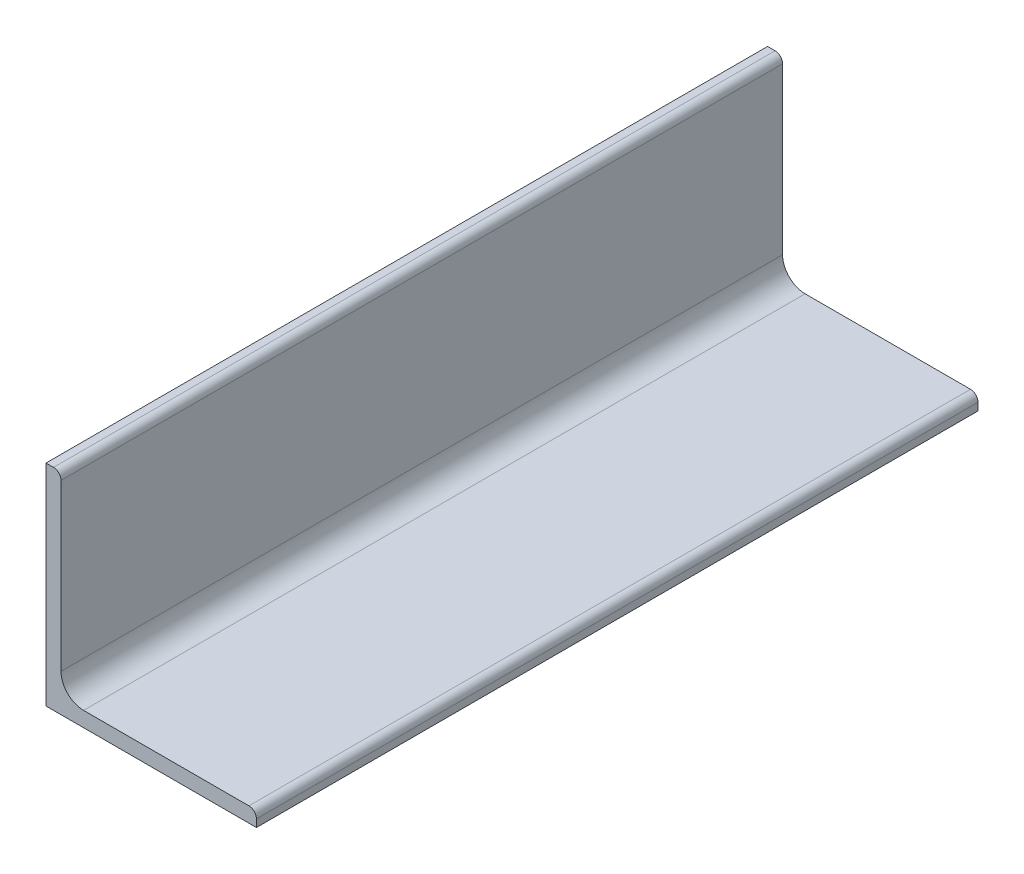
ISO-10303-21;
HEADER;
FILE_DESCRIPTION(('STEP AP214'),'2;1');
FILE_NAME('part.step','',(''),(''),'','','');
FILE_SCHEMA(('AUTOMOTIVE_DESIGN { 1 0 10303 214 1 1 1 1 }'));
ENDSEC;
DATA;
#1=APPLICATION_CONTEXT('core data for automotive mechanical design processes');
#2=APPLICATION_PROTOCOL_DEFINITION('international standard','automotive_design',2000,#1);
#3=PRODUCT_CONTEXT('',#1,'mechanical');
#4=PRODUCT('Part','Part','',(#3));
#5=PRODUCT_RELATED_PRODUCT_CATEGORY('part','',(#4));
#6=PRODUCT_DEFINITION_FORMATION('','',#4);
#7=PRODUCT_DEFINITION_CONTEXT('part definition',#1,'design');
#8=PRODUCT_DEFINITION('design','',#6,#7);
#9=PRODUCT_DEFINITION_SHAPE('','',#8);
#10=(LENGTH_UNIT() NAMED_UNIT(*) SI_UNIT(.MILLI.,.METRE.));
#11=(NAMED_UNIT(*) PLANE_ANGLE_UNIT() SI_UNIT($,.RADIAN.));
#12=(NAMED_UNIT(*) SI_UNIT($,.STERADIAN.) SOLID_ANGLE_UNIT());
#13=UNCERTAINTY_MEASURE_WITH_UNIT(LENGTH_MEASURE(1.E-05),#10,'distance_accuracy_value','');
#14=(GEOMETRIC_REPRESENTATION_CONTEXT(3) GLOBAL_UNCERTAINTY_ASSIGNED_CONTEXT((#13)) GLOBAL_UNIT_ASSIGNED_CONTEXT((#10,
#11,#12)) REPRESENTATION_CONTEXT('',''));
#15=CARTESIAN_POINT('',(0.,0.,0.));
#16=DIRECTION('',(0.,0.,1.));
#17=DIRECTION('',(1.,0.,0.));
#18=AXIS2_PLACEMENT_3D('',#15,#16,#17);
#19=CARTESIAN_POINT('',(0.0836264027816469,89.7372005393545,304.8));
#20=DIRECTION('',(1.,0.,0.));
#21=DIRECTION('',(0.,0.,-1.));
#22=AXIS2_PLACEMENT_3D('',#19,#20,#21);
#23=PLANE('',#22);
#24=DIRECTION('',(0.,-1.,0.));
#25=VECTOR('',#24,1.);
#26=CARTESIAN_POINT('',(0.0836264027816469,89.7372005393545,0.));
#27=LINE('',#26,#25);
#28=CARTESIAN_POINT('',(0.0836264027816469,89.7372005393545,0.));
#29=VERTEX_POINT('',#28);
#30=CARTESIAN_POINT('',(0.0836264027816469,0.837200539354535,0.));
#31=VERTEX_POINT('',#30);
#32=EDGE_CURVE('E135',#29,#31,#27,.T.);
#33=ORIENTED_EDGE('',*,*,#32,.T.);
#34=DIRECTION('',(0.,0.,-1.));
#35=VECTOR('',#34,1.);
#36=CARTESIAN_POINT('',(0.0836264027816469,0.837200539354535,304.8));
#37=LINE('',#36,#35);
#38=CARTESIAN_POINT('',(0.0836264027816469,0.837200539354535,304.8));
#39=VERTEX_POINT('',#38);
#40=EDGE_CURVE('E11',#39,#31,#37,.T.);
#41=ORIENTED_EDGE('',*,*,#40,.F.);
#42=DIRECTION('',(0.,-1.,0.));
#43=VECTOR('',#42,1.);
#44=CARTESIAN_POINT('',(0.0836264027816469,89.7372005393545,304.8));
#45=LINE('',#44,#43);
#46=CARTESIAN_POINT('',(0.0836264027816469,89.7372005393545,304.8));
#47=VERTEX_POINT('',#46);
#48=EDGE_CURVE('E151',#47,#39,#45,.T.);
#49=ORIENTED_EDGE('',*,*,#48,.F.);
#50=DIRECTION('',(0.,0.,-1.));
#51=VECTOR('',#50,1.);
#52=CARTESIAN_POINT('',(0.0836264027816469,89.7372005393545,304.8));
#53=LINE('',#52,#51);
#54=EDGE_CURVE('E131',#47,#29,#53,.T.);
#55=ORIENTED_EDGE('',*,*,#54,.T.);
#56=EDGE_LOOP('',(#33,#41,#49,#55));
#57=FACE_BOUND('',#56,.T.);
#58=ADVANCED_FACE('F33',(#57),#23,.F.);
#59=CARTESIAN_POINT('',(0.0836264027816469,0.837200539354535,304.8));
#60=DIRECTION('',(0.,1.,0.));
#61=DIRECTION('',(0.,0.,1.));
#62=AXIS2_PLACEMENT_3D('',#59,#60,#61);
#63=PLANE('',#62);
#64=DIRECTION('',(1.,0.,0.));
#65=VECTOR('',#64,1.);
#66=CARTESIAN_POINT('',(0.0836264027816469,0.837200539354535,0.));
#67=LINE('',#66,#65);
#68=CARTESIAN_POINT('',(88.9836264027817,0.837200539354535,0.));
#69=VERTEX_POINT('',#68);
#70=EDGE_CURVE('E138',#31,#69,#67,.T.);
#71=ORIENTED_EDGE('',*,*,#70,.T.);
#72=DIRECTION('',(0.,0.,-1.));
#73=VECTOR('',#72,1.);
#74=CARTESIAN_POINT('',(88.9836264027817,0.837200539354535,304.8));
#75=LINE('',#74,#73);
#76=CARTESIAN_POINT('',(88.9836264027817,0.837200539354535,304.8));
#77=VERTEX_POINT('',#76);
#78=EDGE_CURVE('E41',#77,#69,#75,.T.);
#79=ORIENTED_EDGE('',*,*,#78,.F.);
#80=DIRECTION('',(1.,0.,0.));
#81=VECTOR('',#80,1.);
#82=CARTESIAN_POINT('',(0.0836264027816469,0.837200539354535,304.8));
#83=LINE('',#82,#81);
#84=EDGE_CURVE('E95',#39,#77,#83,.T.);
#85=ORIENTED_EDGE('',*,*,#84,.F.);
#86=ORIENTED_EDGE('',*,*,#40,.T.);
#87=EDGE_LOOP('',(#71,#79,#85,#86));
#88=FACE_BOUND('',#87,.T.);
#89=ADVANCED_FACE('F194',(#88),#63,.F.);
#90=CARTESIAN_POINT('',(88.9836264027817,0.837200539354535,304.8));
#91=DIRECTION('',(-1.,0.,0.));
#92=DIRECTION('',(0.,0.,1.));
#93=AXIS2_PLACEMENT_3D('',#90,#91,#92);
#94=PLANE('',#93);
#95=DIRECTION('',(0.,1.,0.));
#96=VECTOR('',#95,1.);
#97=CARTESIAN_POINT('',(88.9836264027817,0.837200539354535,0.));
#98=LINE('',#97,#96);
#99=CARTESIAN_POINT('',(88.9836264027817,4.01220053935453,0.));
#100=VERTEX_POINT('',#99);
#101=EDGE_CURVE('E140',#69,#100,#98,.T.);
#102=ORIENTED_EDGE('',*,*,#101,.T.);
#103=DIRECTION('',(0.,0.,-1.));
#104=VECTOR('',#103,1.);
#105=CARTESIAN_POINT('',(88.9836264027817,4.01220053935453,304.8));
#106=LINE('',#105,#104);
#107=CARTESIAN_POINT('',(88.9836264027817,4.01220053935453,304.8));
#108=VERTEX_POINT('',#107);
#109=EDGE_CURVE('E161',#108,#100,#106,.T.);
#110=ORIENTED_EDGE('',*,*,#109,.F.);
#111=DIRECTION('',(0.,1.,0.));
#112=VECTOR('',#111,1.);
#113=CARTESIAN_POINT('',(88.9836264027817,0.837200539354535,304.8));
#114=LINE('',#113,#112);
#115=EDGE_CURVE('E169',#77,#108,#114,.T.);
#116=ORIENTED_EDGE('',*,*,#115,.F.);
#117=ORIENTED_EDGE('',*,*,#78,.T.);
#118=EDGE_LOOP('',(#102,#110,#116,#117));
#119=FACE_BOUND('',#118,.T.);
#120=ADVANCED_FACE('F167',(#119),#94,.F.);
#121=CARTESIAN_POINT('',(85.8086264027816,4.01220053935453,304.8));
#122=DIRECTION('',(0.,0.,-1.));
#123=DIRECTION('',(-1.,0.,0.));
#124=AXIS2_PLACEMENT_3D('',#121,#122,#123);
#125=CYLINDRICAL_SURFACE('',#124,3.17500000000001);
#126=CARTESIAN_POINT('',(85.8086264027816,4.01220053935453,0.));
#127=DIRECTION('',(0.,0.,1.));
#128=DIRECTION('',(1.,0.,0.));
#129=AXIS2_PLACEMENT_3D('',#126,#127,#128);
#130=CIRCLE('',#129,3.17500000000001);
#131=CARTESIAN_POINT('',(85.8086264027816,7.18720053935454,0.));
#132=VERTEX_POINT('',#131);
#133=EDGE_CURVE('E142',#100,#132,#130,.T.);
#134=ORIENTED_EDGE('',*,*,#133,.T.);
#135=DIRECTION('',(0.,0.,-1.));
#136=VECTOR('',#135,1.);
#137=CARTESIAN_POINT('',(85.8086264027816,7.18720053935454,304.8));
#138=LINE('',#137,#136);
#139=CARTESIAN_POINT('',(85.8086264027816,7.18720053935454,304.8));
#140=VERTEX_POINT('',#139);
#141=EDGE_CURVE('E158',#140,#132,#138,.T.);
#142=ORIENTED_EDGE('',*,*,#141,.F.);
#143=CARTESIAN_POINT('',(85.8086264027816,4.01220053935453,304.8));
#144=DIRECTION('',(0.,0.,1.));
#145=DIRECTION('',(1.,0.,0.));
#146=AXIS2_PLACEMENT_3D('',#143,#144,#145);
#147=CIRCLE('',#146,3.17500000000001);
#148=EDGE_CURVE('E185',#108,#140,#147,.T.);
#149=ORIENTED_EDGE('',*,*,#148,.F.);
#150=ORIENTED_EDGE('',*,*,#109,.T.);
#151=EDGE_LOOP('',(#134,#142,#149,#150));
#152=FACE_BOUND('',#151,.T.);
#153=ADVANCED_FACE('F178',(#152),#125,.T.);
#154=CARTESIAN_POINT('',(85.8086264027816,7.18720053935453,304.8));
#155=DIRECTION('',(0.,-1.,0.));
#156=DIRECTION('',(0.,0.,-1.));
#157=AXIS2_PLACEMENT_3D('',#154,#155,#156);
#158=PLANE('',#157);
#159=DIRECTION('',(-1.,0.,0.));
#160=VECTOR('',#159,1.);
#161=CARTESIAN_POINT('',(85.8086264027816,7.18720053935453,0.));
#162=LINE('',#161,#160);
#163=CARTESIAN_POINT('',(15.9586264027816,7.18720053935453,0.));
#164=VERTEX_POINT('',#163);
#165=EDGE_CURVE('E144',#132,#164,#162,.T.);
#166=ORIENTED_EDGE('',*,*,#165,.T.);
#167=DIRECTION('',(0.,0.,-1.));
#168=VECTOR('',#167,1.);
#169=CARTESIAN_POINT('',(15.9586264027816,7.18720053935453,304.8));
#170=LINE('',#169,#168);
#171=CARTESIAN_POINT('',(15.9586264027816,7.18720053935453,304.8));
#172=VERTEX_POINT('',#171);
#173=EDGE_CURVE('E155',#172,#164,#170,.T.);
#174=ORIENTED_EDGE('',*,*,#173,.F.);
#175=DIRECTION('',(-1.,0.,0.));
#176=VECTOR('',#175,1.);
#177=CARTESIAN_POINT('',(85.8086264027816,7.18720053935453,304.8));
#178=LINE('',#177,#176);
#179=EDGE_CURVE('E184',#140,#172,#178,.T.);
#180=ORIENTED_EDGE('',*,*,#179,.F.);
#181=ORIENTED_EDGE('',*,*,#141,.T.);
#182=EDGE_LOOP('',(#166,#174,#180,#181));
#183=FACE_BOUND('',#182,.T.);
#184=ADVANCED_FACE('F182',(#183),#158,.F.);
#185=CARTESIAN_POINT('',(15.9586264027816,16.7122005393545,304.8));
#186=DIRECTION('',(0.,0.,-1.));
#187=DIRECTION('',(-1.,0.,0.));
#188=AXIS2_PLACEMENT_3D('',#185,#186,#187);
#189=CYLINDRICAL_SURFACE('',#188,9.52499999999999);
#190=CARTESIAN_POINT('',(15.9586264027816,16.7122005393545,0.));
#191=DIRECTION('',(0.,0.,-1.));
#192=DIRECTION('',(1.,0.,0.));
#193=AXIS2_PLACEMENT_3D('',#190,#191,#192);
#194=CIRCLE('',#193,9.52499999999999);
#195=CARTESIAN_POINT('',(6.43362640278164,16.7122005393545,0.));
#196=VERTEX_POINT('',#195);
#197=EDGE_CURVE('E146',#164,#196,#194,.T.);
#198=ORIENTED_EDGE('',*,*,#197,.T.);
#199=DIRECTION('',(0.,0.,-1.));
#200=VECTOR('',#199,1.);
#201=CARTESIAN_POINT('',(6.43362640278164,16.7122005393545,304.8));
#202=LINE('',#201,#200);
#203=CARTESIAN_POINT('',(6.43362640278164,16.7122005393545,304.8));
#204=VERTEX_POINT('',#203);
#205=EDGE_CURVE('E126',#204,#196,#202,.T.);
#206=ORIENTED_EDGE('',*,*,#205,.F.);
#207=CARTESIAN_POINT('',(15.9586264027816,16.7122005393545,304.8));
#208=DIRECTION('',(0.,0.,-1.));
#209=DIRECTION('',(1.,0.,0.));
#210=AXIS2_PLACEMENT_3D('',#207,#208,#209);
#211=CIRCLE('',#210,9.52499999999999);
#212=EDGE_CURVE('E117',#172,#204,#211,.T.);
#213=ORIENTED_EDGE('',*,*,#212,.F.);
#214=ORIENTED_EDGE('',*,*,#173,.T.);
#215=EDGE_LOOP('',(#198,#206,#213,#214));
#216=FACE_BOUND('',#215,.T.);
#217=ADVANCED_FACE('F206',(#216),#189,.F.);
#218=CARTESIAN_POINT('',(6.43362640278165,16.7122005393545,304.8));
#219=DIRECTION('',(-1.,0.,0.));
#220=DIRECTION('',(0.,0.,1.));
#221=AXIS2_PLACEMENT_3D('',#218,#219,#220);
#222=PLANE('',#221);
#223=DIRECTION('',(0.,1.,0.));
#224=VECTOR('',#223,1.);
#225=CARTESIAN_POINT('',(6.43362640278165,16.7122005393545,0.));
#226=LINE('',#225,#224);
#227=CARTESIAN_POINT('',(6.43362640278165,86.5622005393545,0.));
#228=VERTEX_POINT('',#227);
#229=EDGE_CURVE('E125',#196,#228,#226,.T.);
#230=ORIENTED_EDGE('',*,*,#229,.T.);
#231=DIRECTION('',(0.,0.,-1.));
#232=VECTOR('',#231,1.);
#233=CARTESIAN_POINT('',(6.43362640278165,86.5622005393545,304.8));
#234=LINE('',#233,#232);
#235=CARTESIAN_POINT('',(6.43362640278165,86.5622005393545,304.8));
#236=VERTEX_POINT('',#235);
#237=EDGE_CURVE('E122',#236,#228,#234,.T.);
#238=ORIENTED_EDGE('',*,*,#237,.F.);
#239=DIRECTION('',(0.,1.,0.));
#240=VECTOR('',#239,1.);
#241=CARTESIAN_POINT('',(6.43362640278165,16.7122005393545,304.8));
#242=LINE('',#241,#240);
#243=EDGE_CURVE('E111',#204,#236,#242,.T.);
#244=ORIENTED_EDGE('',*,*,#243,.F.);
#245=ORIENTED_EDGE('',*,*,#205,.T.);
#246=EDGE_LOOP('',(#230,#238,#244,#245));
#247=FACE_BOUND('',#246,.T.);
#248=ADVANCED_FACE('F123',(#247),#222,.F.);
#249=CARTESIAN_POINT('',(3.25862640278164,86.5622005393545,304.8));
#250=DIRECTION('',(0.,0.,-1.));
#251=DIRECTION('',(-1.,0.,0.));
#252=AXIS2_PLACEMENT_3D('',#249,#250,#251);
#253=CYLINDRICAL_SURFACE('',#252,3.17500000000001);
#254=CARTESIAN_POINT('',(3.25862640278164,86.5622005393545,0.));
#255=DIRECTION('',(0.,0.,1.));
#256=DIRECTION('',(1.,0.,0.));
#257=AXIS2_PLACEMENT_3D('',#254,#255,#256);
#258=CIRCLE('',#257,3.17500000000001);
#259=CARTESIAN_POINT('',(3.25862640278165,89.7372005393545,0.));
#260=VERTEX_POINT('',#259);
#261=EDGE_CURVE('E81',#228,#260,#258,.T.);
#262=ORIENTED_EDGE('',*,*,#261,.T.);
#263=DIRECTION('',(0.,0.,-1.));
#264=VECTOR('',#263,1.);
#265=CARTESIAN_POINT('',(3.25862640278165,89.7372005393545,304.8));
#266=LINE('',#265,#264);
#267=CARTESIAN_POINT('',(3.25862640278165,89.7372005393545,304.8));
#268=VERTEX_POINT('',#267);
#269=EDGE_CURVE('E127',#268,#260,#266,.T.);
#270=ORIENTED_EDGE('',*,*,#269,.F.);
#271=CARTESIAN_POINT('',(3.25862640278164,86.5622005393545,304.8));
#272=DIRECTION('',(0.,0.,1.));
#273=DIRECTION('',(1.,0.,0.));
#274=AXIS2_PLACEMENT_3D('',#271,#272,#273);
#275=CIRCLE('',#274,3.17500000000001);
#276=EDGE_CURVE('E115',#236,#268,#275,.T.);
#277=ORIENTED_EDGE('',*,*,#276,.F.);
#278=ORIENTED_EDGE('',*,*,#237,.T.);
#279=EDGE_LOOP('',(#262,#270,#277,#278));
#280=FACE_BOUND('',#279,.T.);
#281=ADVANCED_FACE('F129',(#280),#253,.T.);
#282=CARTESIAN_POINT('',(3.25862640278165,89.7372005393545,304.8));
#283=DIRECTION('',(0.,-1.,0.));
#284=DIRECTION('',(0.,0.,-1.));
#285=AXIS2_PLACEMENT_3D('',#282,#283,#284);
#286=PLANE('',#285);
#287=DIRECTION('',(-1.,0.,0.));
#288=VECTOR('',#287,1.);
#289=CARTESIAN_POINT('',(3.25862640278165,89.7372005393545,0.));
#290=LINE('',#289,#288);
#291=EDGE_CURVE('E87',#260,#29,#290,.T.);
#292=ORIENTED_EDGE('',*,*,#291,.T.);
#293=ORIENTED_EDGE('',*,*,#54,.F.);
#294=DIRECTION('',(-1.,0.,0.));
#295=VECTOR('',#294,1.);
#296=CARTESIAN_POINT('',(3.25862640278165,89.7372005393545,304.8));
#297=LINE('',#296,#295);
#298=EDGE_CURVE('E49',#268,#47,#297,.T.);
#299=ORIENTED_EDGE('',*,*,#298,.F.);
#300=ORIENTED_EDGE('',*,*,#269,.T.);
#301=EDGE_LOOP('',(#292,#293,#299,#300));
#302=FACE_BOUND('',#301,.T.);
#303=ADVANCED_FACE('F214',(#302),#286,.F.);
#304=CARTESIAN_POINT('',(85.8086264027816,4.01220053935453,304.8));
#305=DIRECTION('',(0.,0.,1.));
#306=DIRECTION('',(1.,0.,0.));
#307=AXIS2_PLACEMENT_3D('',#304,#305,#306);
#308=PLANE('',#307);
#309=ORIENTED_EDGE('',*,*,#48,.T.);
#310=ORIENTED_EDGE('',*,*,#84,.T.);
#311=ORIENTED_EDGE('',*,*,#115,.T.);
#312=ORIENTED_EDGE('',*,*,#148,.T.);
#313=ORIENTED_EDGE('',*,*,#179,.T.);
#314=ORIENTED_EDGE('',*,*,#212,.T.);
#315=ORIENTED_EDGE('',*,*,#243,.T.);
#316=ORIENTED_EDGE('',*,*,#276,.T.);
#317=ORIENTED_EDGE('',*,*,#298,.T.);
#318=EDGE_LOOP('',(#309,#310,#311,#312,#313,#314,#315,#316,#317));
#319=FACE_BOUND('',#318,.T.);
#320=ADVANCED_FACE('F113',(#319),#308,.T.);
#321=CARTESIAN_POINT('',(85.8086264027816,4.01220053935453,0.));
#322=DIRECTION('',(0.,0.,1.));
#323=DIRECTION('',(1.,0.,0.));
#324=AXIS2_PLACEMENT_3D('',#321,#322,#323);
#325=PLANE('',#324);
#326=ORIENTED_EDGE('',*,*,#32,.F.);
#327=ORIENTED_EDGE('',*,*,#291,.F.);
#328=ORIENTED_EDGE('',*,*,#261,.F.);
#329=ORIENTED_EDGE('',*,*,#229,.F.);
#330=ORIENTED_EDGE('',*,*,#197,.F.);
#331=ORIENTED_EDGE('',*,*,#165,.F.);
#332=ORIENTED_EDGE('',*,*,#133,.F.);
#333=ORIENTED_EDGE('',*,*,#101,.F.);
#334=ORIENTED_EDGE('',*,*,#70,.F.);
#335=EDGE_LOOP('',(#326,#327,#328,#329,#330,#331,#332,#333,#334));
#336=FACE_BOUND('',#335,.T.);
#337=ADVANCED_FACE('F173',(#336),#325,.F.);
#338=CLOSED_SHELL('',(#58,#89,#120,#153,#184,#217,#248,#281,#303,#320,#337));
#339=MANIFOLD_SOLID_BREP('B2',#338);
#340=ADVANCED_BREP_SHAPE_REPRESENTATION('',(#18,#339),#14);
#341=SHAPE_DEFINITION_REPRESENTATION(#9,#340);
ENDSEC;
END-ISO-10303-21;
